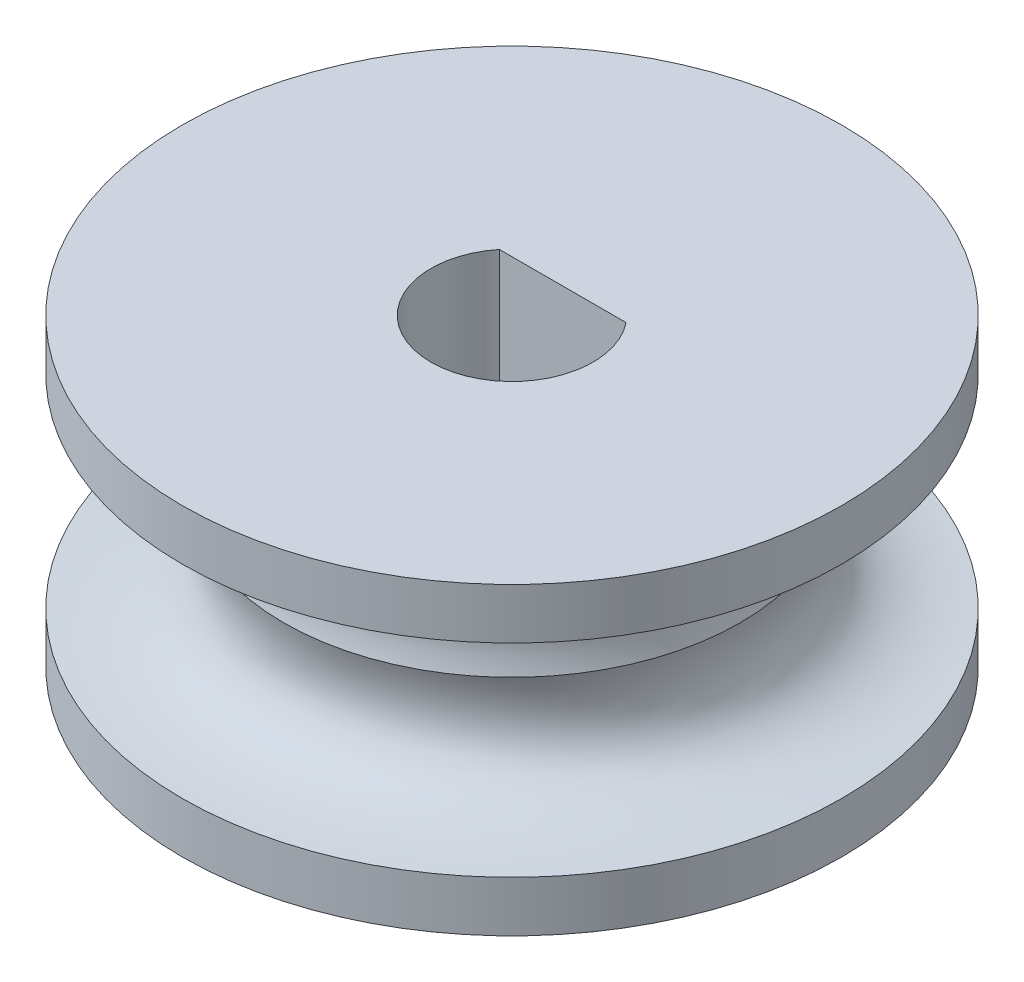
ISO-10303-21;
HEADER;
FILE_DESCRIPTION(('STEP AP214'),'2;1');
FILE_NAME('part.step','',(''),(''),'','','');
FILE_SCHEMA(('AUTOMOTIVE_DESIGN { 1 0 10303 214 1 1 1 1 }'));
ENDSEC;
DATA;
#1=APPLICATION_CONTEXT('core data for automotive mechanical design processes');
#2=APPLICATION_PROTOCOL_DEFINITION('international standard','automotive_design',2000,#1);
#3=PRODUCT_CONTEXT('',#1,'mechanical');
#4=PRODUCT('Part','Part','',(#3));
#5=PRODUCT_RELATED_PRODUCT_CATEGORY('part','',(#4));
#6=PRODUCT_DEFINITION_FORMATION('','',#4);
#7=PRODUCT_DEFINITION_CONTEXT('part definition',#1,'design');
#8=PRODUCT_DEFINITION('design','',#6,#7);
#9=PRODUCT_DEFINITION_SHAPE('','',#8);
#10=(LENGTH_UNIT() NAMED_UNIT(*) SI_UNIT(.MILLI.,.METRE.));
#11=(NAMED_UNIT(*) PLANE_ANGLE_UNIT() SI_UNIT($,.RADIAN.));
#12=(NAMED_UNIT(*) SI_UNIT($,.STERADIAN.) SOLID_ANGLE_UNIT());
#13=UNCERTAINTY_MEASURE_WITH_UNIT(LENGTH_MEASURE(1.E-05),#10,'distance_accuracy_value','');
#14=(GEOMETRIC_REPRESENTATION_CONTEXT(3) GLOBAL_UNCERTAINTY_ASSIGNED_CONTEXT((#13)) GLOBAL_UNIT_ASSIGNED_CONTEXT((#10,
#11,#12)) REPRESENTATION_CONTEXT('',''));
#15=CARTESIAN_POINT('',(0.,0.,0.));
#16=DIRECTION('',(0.,0.,1.));
#17=DIRECTION('',(1.,0.,0.));
#18=AXIS2_PLACEMENT_3D('',#15,#16,#17);
#19=CARTESIAN_POINT('',(0.,0.,0.));
#20=DIRECTION('',(0.,-1.,0.));
#21=DIRECTION('',(0.,0.,-1.));
#22=AXIS2_PLACEMENT_3D('',#19,#20,#21);
#23=PLANE('',#22);
#24=CARTESIAN_POINT('',(0.,0.,0.));
#25=DIRECTION('',(0.,-1.,0.));
#26=DIRECTION('',(0.,0.,-1.));
#27=AXIS2_PLACEMENT_3D('',#24,#25,#26);
#28=CIRCLE('',#27,6.5);
#29=CARTESIAN_POINT('',(0.,0.,-6.5));
#30=VERTEX_POINT('',#29);
#31=EDGE_CURVE('E121',#30,#30,#28,.T.);
#32=ORIENTED_EDGE('',*,*,#31,.F.);
#33=EDGE_LOOP('',(#32));
#34=FACE_BOUND('',#33,.T.);
#35=CARTESIAN_POINT('',(0.,0.,0.));
#36=DIRECTION('',(0.,1.,0.));
#37=DIRECTION('',(0.,0.,1.));
#38=AXIS2_PLACEMENT_3D('',#35,#36,#37);
#39=CIRCLE('',#38,1.6);
#40=CARTESIAN_POINT('',(-1.24899959967968,0.,-1.));
#41=VERTEX_POINT('',#40);
#42=CARTESIAN_POINT('',(1.24899959967968,0.,-1.));
#43=VERTEX_POINT('',#42);
#44=EDGE_CURVE('E74',#41,#43,#39,.T.);
#45=ORIENTED_EDGE('',*,*,#44,.F.);
#46=DIRECTION('',(-1.,0.,0.));
#47=VECTOR('',#46,1.);
#48=CARTESIAN_POINT('',(0.,0.,-1.));
#49=LINE('',#48,#47);
#50=EDGE_CURVE('E86',#43,#41,#49,.T.);
#51=ORIENTED_EDGE('',*,*,#50,.F.);
#52=EDGE_LOOP('',(#45,#51));
#53=FACE_BOUND('',#52,.T.);
#54=ADVANCED_FACE('F39',(#34,#53),#23,.F.);
#55=CARTESIAN_POINT('',(0.,-6.,0.));
#56=DIRECTION('',(0.,1.,0.));
#57=DIRECTION('',(0.,0.,-1.));
#58=AXIS2_PLACEMENT_3D('',#55,#56,#57);
#59=PLANE('',#58);
#60=CARTESIAN_POINT('',(0.,-6.,0.));
#61=DIRECTION('',(0.,-1.,0.));
#62=DIRECTION('',(0.,0.,-1.));
#63=AXIS2_PLACEMENT_3D('',#60,#61,#62);
#64=CIRCLE('',#63,6.5);
#65=CARTESIAN_POINT('',(0.,-6.,-6.5));
#66=VERTEX_POINT('',#65);
#67=EDGE_CURVE('E80',#66,#66,#64,.T.);
#68=ORIENTED_EDGE('',*,*,#67,.T.);
#69=EDGE_LOOP('',(#68));
#70=FACE_BOUND('',#69,.T.);
#71=CARTESIAN_POINT('',(0.,-6.,0.));
#72=DIRECTION('',(0.,1.,0.));
#73=DIRECTION('',(0.,0.,1.));
#74=AXIS2_PLACEMENT_3D('',#71,#72,#73);
#75=CIRCLE('',#74,1.6);
#76=CARTESIAN_POINT('',(-1.24899959967968,-6.,-1.));
#77=VERTEX_POINT('',#76);
#78=CARTESIAN_POINT('',(1.24899959967968,-6.,-1.));
#79=VERTEX_POINT('',#78);
#80=EDGE_CURVE('E63',#77,#79,#75,.T.);
#81=ORIENTED_EDGE('',*,*,#80,.T.);
#82=DIRECTION('',(-1.,0.,0.));
#83=VECTOR('',#82,1.);
#84=CARTESIAN_POINT('',(0.,-6.,-1.));
#85=LINE('',#84,#83);
#86=EDGE_CURVE('E69',#79,#77,#85,.T.);
#87=ORIENTED_EDGE('',*,*,#86,.T.);
#88=EDGE_LOOP('',(#81,#87));
#89=FACE_BOUND('',#88,.T.);
#90=ADVANCED_FACE('F82',(#70,#89),#59,.F.);
#91=CARTESIAN_POINT('',(-6.5,-1.,0.));
#92=CARTESIAN_POINT('',(-5.51525015465731,-1.04724327082471,0.));
#93=CARTESIAN_POINT('',(-4.0026072853685,-1.25459372046941,0.));
#94=CARTESIAN_POINT('',(-4.5,-3.,0.));
#95=B_SPLINE_CURVE_WITH_KNOTS('',3,(#91,#92,#93,#94),.UNSPECIFIED.,.F.,.F.,(4,4),(0.,1.),.UNSPECIFIED.);
#96=CARTESIAN_POINT('',(0.,-3.,0.));
#97=DIRECTION('',(0.,-1.,0.));
#98=AXIS1_PLACEMENT('',#96,#97);
#99=SURFACE_OF_REVOLUTION('',#95,#98);
#100=CARTESIAN_POINT('',(0.,-3.,0.));
#101=DIRECTION('',(0.,-1.,0.));
#102=DIRECTION('',(0.,0.,-1.));
#103=AXIS2_PLACEMENT_3D('',#100,#101,#102);
#104=CIRCLE('',#103,4.5);
#105=CARTESIAN_POINT('',(0.,-3.,-4.5));
#106=VERTEX_POINT('',#105);
#107=EDGE_CURVE('E11',#106,#106,#104,.T.);
#108=ORIENTED_EDGE('',*,*,#107,.F.);
#109=EDGE_LOOP('',(#108));
#110=FACE_BOUND('',#109,.T.);
#111=CARTESIAN_POINT('',(0.,-1.,0.));
#112=DIRECTION('',(0.,-1.,0.));
#113=DIRECTION('',(0.,0.,-1.));
#114=AXIS2_PLACEMENT_3D('',#111,#112,#113);
#115=CIRCLE('',#114,6.5);
#116=CARTESIAN_POINT('',(0.,-1.,-6.5));
#117=VERTEX_POINT('',#116);
#118=EDGE_CURVE('E49',#117,#117,#115,.T.);
#119=ORIENTED_EDGE('',*,*,#118,.T.);
#120=EDGE_LOOP('',(#119));
#121=FACE_BOUND('',#120,.T.);
#122=ADVANCED_FACE('F41',(#110,#121),#99,.T.);
#123=CARTESIAN_POINT('',(0.,-3.,0.));
#124=DIRECTION('',(0.,-1.,0.));
#125=DIRECTION('',(0.,0.,-1.));
#126=AXIS2_PLACEMENT_3D('',#123,#124,#125);
#127=CYLINDRICAL_SURFACE('',#126,6.5);
#128=ORIENTED_EDGE('',*,*,#118,.F.);
#129=EDGE_LOOP('',(#128));
#130=FACE_BOUND('',#129,.T.);
#131=ORIENTED_EDGE('',*,*,#31,.T.);
#132=EDGE_LOOP('',(#131));
#133=FACE_BOUND('',#132,.T.);
#134=ADVANCED_FACE('F105',(#130,#133),#127,.T.);
#135=CARTESIAN_POINT('',(-6.5,-5.,0.));
#136=CARTESIAN_POINT('',(-5.51525015465731,-4.9527567291753,0.));
#137=CARTESIAN_POINT('',(-4.0026072853685,-4.74540627953059,0.));
#138=CARTESIAN_POINT('',(-4.5,-3.,0.));
#139=B_SPLINE_CURVE_WITH_KNOTS('',3,(#135,#136,#137,#138),.UNSPECIFIED.,.F.,.F.,(4,4),(0.,1.),.UNSPECIFIED.);
#140=CARTESIAN_POINT('',(0.,-3.,0.));
#141=DIRECTION('',(0.,1.,0.));
#142=AXIS1_PLACEMENT('',#140,#141);
#143=SURFACE_OF_REVOLUTION('',#139,#142);
#144=ORIENTED_EDGE('',*,*,#107,.T.);
#145=EDGE_LOOP('',(#144));
#146=FACE_BOUND('',#145,.T.);
#147=CARTESIAN_POINT('',(0.,-5.,0.));
#148=DIRECTION('',(0.,-1.,0.));
#149=DIRECTION('',(0.,0.,-1.));
#150=AXIS2_PLACEMENT_3D('',#147,#148,#149);
#151=CIRCLE('',#150,6.5);
#152=CARTESIAN_POINT('',(0.,-5.,-6.5));
#153=VERTEX_POINT('',#152);
#154=EDGE_CURVE('E123',#153,#153,#151,.T.);
#155=ORIENTED_EDGE('',*,*,#154,.F.);
#156=EDGE_LOOP('',(#155));
#157=FACE_BOUND('',#156,.T.);
#158=ADVANCED_FACE('F100',(#146,#157),#143,.T.);
#159=CARTESIAN_POINT('',(0.,-3.,0.));
#160=DIRECTION('',(0.,1.,0.));
#161=DIRECTION('',(0.,0.,-1.));
#162=AXIS2_PLACEMENT_3D('',#159,#160,#161);
#163=CYLINDRICAL_SURFACE('',#162,6.5);
#164=ORIENTED_EDGE('',*,*,#154,.T.);
#165=EDGE_LOOP('',(#164));
#166=FACE_BOUND('',#165,.T.);
#167=ORIENTED_EDGE('',*,*,#67,.F.);
#168=EDGE_LOOP('',(#167));
#169=FACE_BOUND('',#168,.T.);
#170=ADVANCED_FACE('F104',(#166,#169),#163,.T.);
#171=CARTESIAN_POINT('',(0.,0.,0.));
#172=DIRECTION('',(0.,-1.,0.));
#173=DIRECTION('',(0.,0.,-1.));
#174=AXIS2_PLACEMENT_3D('',#171,#172,#173);
#175=CYLINDRICAL_SURFACE('',#174,1.6);
#176=ORIENTED_EDGE('',*,*,#80,.F.);
#177=DIRECTION('',(0.,-1.,0.));
#178=VECTOR('',#177,1.);
#179=CARTESIAN_POINT('',(-1.24899959967968,0.,-1.));
#180=LINE('',#179,#178);
#181=EDGE_CURVE('E71',#41,#77,#180,.T.);
#182=ORIENTED_EDGE('',*,*,#181,.F.);
#183=ORIENTED_EDGE('',*,*,#44,.T.);
#184=DIRECTION('',(0.,-1.,0.));
#185=VECTOR('',#184,1.);
#186=CARTESIAN_POINT('',(1.24899959967968,0.,-1.));
#187=LINE('',#186,#185);
#188=EDGE_CURVE('E56',#43,#79,#187,.T.);
#189=ORIENTED_EDGE('',*,*,#188,.T.);
#190=EDGE_LOOP('',(#176,#182,#183,#189));
#191=FACE_BOUND('',#190,.T.);
#192=ADVANCED_FACE('F76',(#191),#175,.F.);
#193=CARTESIAN_POINT('',(0.,0.,-1.));
#194=DIRECTION('',(0.,0.,1.));
#195=DIRECTION('',(1.,0.,0.));
#196=AXIS2_PLACEMENT_3D('',#193,#194,#195);
#197=PLANE('',#196);
#198=ORIENTED_EDGE('',*,*,#86,.F.);
#199=ORIENTED_EDGE('',*,*,#188,.F.);
#200=ORIENTED_EDGE('',*,*,#50,.T.);
#201=ORIENTED_EDGE('',*,*,#181,.T.);
#202=EDGE_LOOP('',(#198,#199,#200,#201));
#203=FACE_BOUND('',#202,.T.);
#204=ADVANCED_FACE('F70',(#203),#197,.T.);
#205=CLOSED_SHELL('',(#54,#90,#122,#134,#158,#170,#192,#204));
#206=MANIFOLD_SOLID_BREP('B2',#205);
#207=ADVANCED_BREP_SHAPE_REPRESENTATION('',(#18,#206),#14);
#208=SHAPE_DEFINITION_REPRESENTATION(#9,#207);
ENDSEC;
END-ISO-10303-21;
